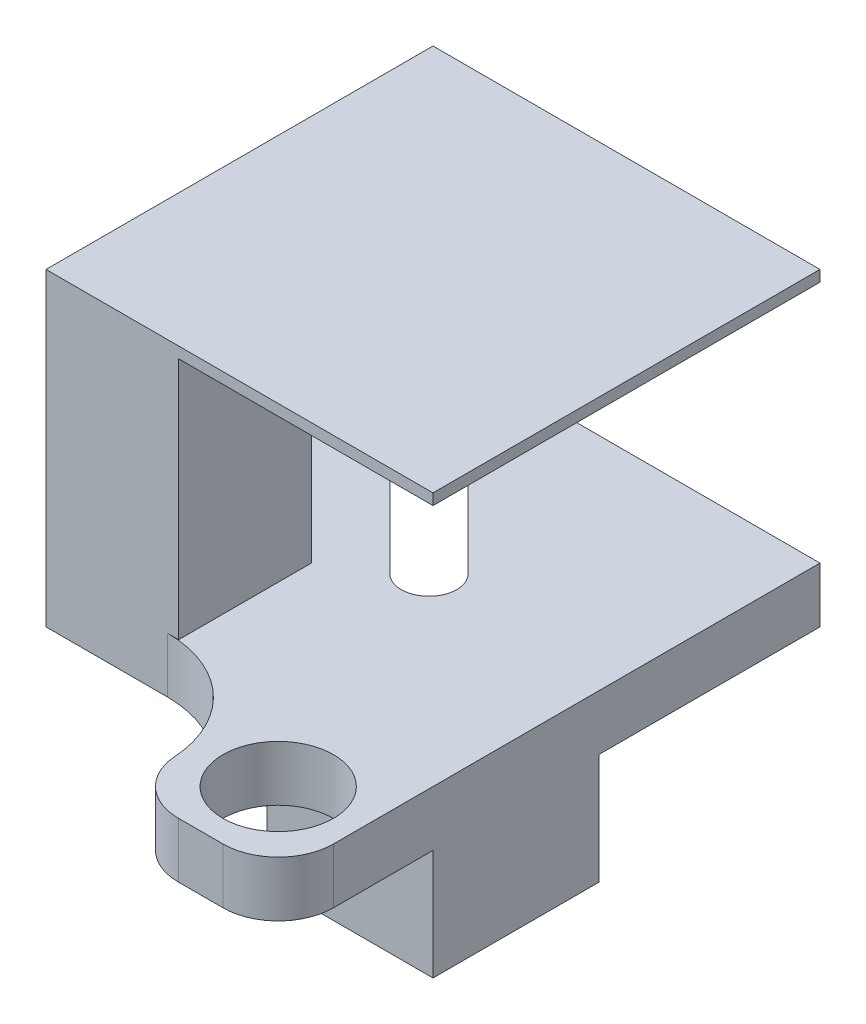
ISO-10303-21;
HEADER;
FILE_DESCRIPTION(('STEP AP214'),'2;1');
FILE_NAME('part.step','',(''),(''),'','','');
FILE_SCHEMA(('AUTOMOTIVE_DESIGN { 1 0 10303 214 1 1 1 1 }'));
ENDSEC;
DATA;
#1=APPLICATION_CONTEXT('core data for automotive mechanical design processes');
#2=APPLICATION_PROTOCOL_DEFINITION('international standard','automotive_design',2000,#1);
#3=PRODUCT_CONTEXT('',#1,'mechanical');
#4=PRODUCT('Part','Part','',(#3));
#5=PRODUCT_RELATED_PRODUCT_CATEGORY('part','',(#4));
#6=PRODUCT_DEFINITION_FORMATION('','',#4);
#7=PRODUCT_DEFINITION_CONTEXT('part definition',#1,'design');
#8=PRODUCT_DEFINITION('design','',#6,#7);
#9=PRODUCT_DEFINITION_SHAPE('','',#8);
#10=(LENGTH_UNIT() NAMED_UNIT(*) SI_UNIT(.MILLI.,.METRE.));
#11=(NAMED_UNIT(*) PLANE_ANGLE_UNIT() SI_UNIT($,.RADIAN.));
#12=(NAMED_UNIT(*) SI_UNIT($,.STERADIAN.) SOLID_ANGLE_UNIT());
#13=UNCERTAINTY_MEASURE_WITH_UNIT(LENGTH_MEASURE(1.E-05),#10,'distance_accuracy_value','');
#14=(GEOMETRIC_REPRESENTATION_CONTEXT(3) GLOBAL_UNCERTAINTY_ASSIGNED_CONTEXT((#13)) GLOBAL_UNIT_ASSIGNED_CONTEXT((#10,
#11,#12)) REPRESENTATION_CONTEXT('',''));
#15=CARTESIAN_POINT('',(0.,0.,0.));
#16=DIRECTION('',(0.,0.,1.));
#17=DIRECTION('',(1.,0.,0.));
#18=AXIS2_PLACEMENT_3D('',#15,#16,#17);
#19=CARTESIAN_POINT('',(21.,5.,0.));
#20=DIRECTION('',(0.,0.,-1.));
#21=DIRECTION('',(-1.,0.,0.));
#22=AXIS2_PLACEMENT_3D('',#19,#20,#21);
#23=PLANE('',#22);
#24=DIRECTION('',(-1.,0.,0.));
#25=VECTOR('',#24,1.);
#26=CARTESIAN_POINT('',(35.,0.,0.));
#27=LINE('',#26,#25);
#28=CARTESIAN_POINT('',(35.,0.,0.));
#29=VERTEX_POINT('',#28);
#30=CARTESIAN_POINT('',(20.,0.,0.));
#31=VERTEX_POINT('',#30);
#32=EDGE_CURVE('E264',#29,#31,#27,.T.);
#33=ORIENTED_EDGE('',*,*,#32,.T.);
#34=DIRECTION('',(0.,1.,0.));
#35=VECTOR('',#34,1.);
#36=CARTESIAN_POINT('',(20.,-10.,0.));
#37=LINE('',#36,#35);
#38=CARTESIAN_POINT('',(20.,-10.,0.));
#39=VERTEX_POINT('',#38);
#40=EDGE_CURVE('E306',#39,#31,#37,.T.);
#41=ORIENTED_EDGE('',*,*,#40,.F.);
#42=DIRECTION('',(-1.,0.,0.));
#43=VECTOR('',#42,1.);
#44=CARTESIAN_POINT('',(35.,-10.,0.));
#45=LINE('',#44,#43);
#46=CARTESIAN_POINT('',(35.,-10.,0.));
#47=VERTEX_POINT('',#46);
#48=EDGE_CURVE('E265',#47,#39,#45,.T.);
#49=ORIENTED_EDGE('',*,*,#48,.F.);
#50=DIRECTION('',(0.,1.,0.));
#51=VECTOR('',#50,1.);
#52=CARTESIAN_POINT('',(35.,-10.,0.));
#53=LINE('',#52,#51);
#54=EDGE_CURVE('E279',#47,#29,#53,.T.);
#55=ORIENTED_EDGE('',*,*,#54,.T.);
#56=EDGE_LOOP('',(#33,#41,#49,#55));
#57=FACE_BOUND('',#56,.T.);
#58=ADVANCED_FACE('F33',(#57),#23,.F.);
#59=CARTESIAN_POINT('',(0.,5.,0.));
#60=DIRECTION('',(0.,-1.,0.));
#61=DIRECTION('',(0.,0.,-1.));
#62=AXIS2_PLACEMENT_3D('',#59,#60,#61);
#63=PLANE('',#62);
#64=CARTESIAN_POINT('',(28.,5.,7.));
#65=DIRECTION('',(0.,1.,0.));
#66=DIRECTION('',(0.,0.,1.));
#67=AXIS2_PLACEMENT_3D('',#64,#65,#66);
#68=CIRCLE('',#67,5.);
#69=CARTESIAN_POINT('',(28.,5.,12.));
#70=VERTEX_POINT('',#69);
#71=EDGE_CURVE('E310',#70,#70,#68,.T.);
#72=ORIENTED_EDGE('',*,*,#71,.F.);
#73=EDGE_LOOP('',(#72));
#74=FACE_BOUND('',#73,.T.);
#75=CARTESIAN_POINT('',(3.8408297161038,5.,-30.8136023073707));
#76=DIRECTION('',(0.,1.,0.));
#77=DIRECTION('',(0.,0.,1.));
#78=AXIS2_PLACEMENT_3D('',#75,#76,#77);
#79=CIRCLE('',#78,2.50307538743037);
#80=CARTESIAN_POINT('',(5.77728434988736,5.,-32.3996445030446));
#81=VERTEX_POINT('',#80);
#82=CARTESIAN_POINT('',(2.07088813583075,5.,-29.0436607270975));
#83=VERTEX_POINT('',#82);
#84=EDGE_CURVE('E316',#81,#83,#79,.T.);
#85=ORIENTED_EDGE('',*,*,#84,.F.);
#86=DIRECTION('',(-0.707106781186551,0.,-0.707106781186543));
#87=VECTOR('',#86,1.);
#88=CARTESIAN_POINT('',(5.77728434988736,5.,-32.3996445030446));
#89=LINE('',#88,#87);
#90=CARTESIAN_POINT('',(19.9194199736268,5.,-18.2575088793053));
#91=VERTEX_POINT('',#90);
#92=EDGE_CURVE('E324',#91,#81,#89,.T.);
#93=ORIENTED_EDGE('',*,*,#92,.F.);
#94=CARTESIAN_POINT('',(18.1494783933532,5.,-16.4875672990317));
#95=DIRECTION('',(0.,1.,0.));
#96=DIRECTION('',(0.,0.,1.));
#97=AXIS2_PLACEMENT_3D('',#94,#95,#96);
#98=CIRCLE('',#97,2.50307538743099);
#99=CARTESIAN_POINT('',(16.2130237595617,5.,-14.9015251033665));
#100=VERTEX_POINT('',#99);
#101=EDGE_CURVE('E321',#100,#91,#98,.T.);
#102=ORIENTED_EDGE('',*,*,#101,.F.);
#103=DIRECTION('',(0.707106781186549,0.,0.707106781186546));
#104=VECTOR('',#103,1.);
#105=CARTESIAN_POINT('',(16.2130237595617,5.,-14.9015251033666));
#106=LINE('',#105,#104);
#107=EDGE_CURVE('E318',#83,#100,#106,.T.);
#108=ORIENTED_EDGE('',*,*,#107,.F.);
#109=EDGE_LOOP('',(#85,#93,#102,#108));
#110=FACE_BOUND('',#109,.T.);
#111=DIRECTION('',(1.,0.,0.));
#112=VECTOR('',#111,1.);
#113=CARTESIAN_POINT('',(35.,5.,14.));
#114=LINE('',#113,#112);
#115=CARTESIAN_POINT('',(25.9666295470958,5.,14.));
#116=VERTEX_POINT('',#115);
#117=CARTESIAN_POINT('',(30.,5.,14.));
#118=VERTEX_POINT('',#117);
#119=EDGE_CURVE('E347',#116,#118,#114,.T.);
#120=ORIENTED_EDGE('',*,*,#119,.T.);
#121=CARTESIAN_POINT('',(30.,5.,9.));
#122=DIRECTION('',(0.,-1.,0.));
#123=DIRECTION('',(0.,0.,-1.));
#124=AXIS2_PLACEMENT_3D('',#121,#122,#123);
#125=CIRCLE('',#124,5.);
#126=CARTESIAN_POINT('',(35.,5.,9.));
#127=VERTEX_POINT('',#126);
#128=EDGE_CURVE('E41',#118,#127,#125,.F.);
#129=ORIENTED_EDGE('',*,*,#128,.T.);
#130=DIRECTION('',(0.,0.,-1.));
#131=VECTOR('',#130,1.);
#132=CARTESIAN_POINT('',(35.,5.,0.));
#133=LINE('',#132,#131);
#134=CARTESIAN_POINT('',(35.,5.,-35.));
#135=VERTEX_POINT('',#134);
#136=EDGE_CURVE('E349',#127,#135,#133,.T.);
#137=ORIENTED_EDGE('',*,*,#136,.T.);
#138=DIRECTION('',(-1.,0.,0.));
#139=VECTOR('',#138,1.);
#140=CARTESIAN_POINT('',(35.,5.,-35.));
#141=LINE('',#140,#139);
#142=CARTESIAN_POINT('',(0.,5.,-35.));
#143=VERTEX_POINT('',#142);
#144=EDGE_CURVE('E351',#135,#143,#141,.T.);
#145=ORIENTED_EDGE('',*,*,#144,.T.);
#146=DIRECTION('',(0.,0.,1.));
#147=VECTOR('',#146,1.);
#148=CARTESIAN_POINT('',(0.,5.,0.));
#149=LINE('',#148,#147);
#150=CARTESIAN_POINT('',(0.,5.,-12.));
#151=VERTEX_POINT('',#150);
#152=EDGE_CURVE('E209',#143,#151,#149,.T.);
#153=ORIENTED_EDGE('',*,*,#152,.T.);
#154=DIRECTION('',(-1.,0.,0.));
#155=VECTOR('',#154,1.);
#156=CARTESIAN_POINT('',(0.,5.,-12.));
#157=LINE('',#156,#155);
#158=CARTESIAN_POINT('',(12.,5.,-12.));
#159=VERTEX_POINT('',#158);
#160=EDGE_CURVE('E248',#159,#151,#157,.T.);
#161=ORIENTED_EDGE('',*,*,#160,.F.);
#162=DIRECTION('',(0.,0.,-1.));
#163=VECTOR('',#162,1.);
#164=CARTESIAN_POINT('',(12.,5.,0.));
#165=LINE('',#164,#163);
#166=CARTESIAN_POINT('',(12.,5.,0.));
#167=VERTEX_POINT('',#166);
#168=EDGE_CURVE('E243',#167,#159,#165,.T.);
#169=ORIENTED_EDGE('',*,*,#168,.F.);
#170=DIRECTION('',(1.,0.,0.));
#171=VECTOR('',#170,1.);
#172=CARTESIAN_POINT('',(0.,5.,0.));
#173=LINE('',#172,#171);
#174=CARTESIAN_POINT('',(11.,5.,0.));
#175=VERTEX_POINT('',#174);
#176=EDGE_CURVE('E368',#175,#167,#173,.T.);
#177=ORIENTED_EDGE('',*,*,#176,.F.);
#178=CARTESIAN_POINT('',(11.,5.,10.));
#179=DIRECTION('',(0.,-1.,0.));
#180=DIRECTION('',(0.,0.,-1.));
#181=AXIS2_PLACEMENT_3D('',#178,#179,#180);
#182=CIRCLE('',#181,10.);
#183=CARTESIAN_POINT('',(20.9777530313972,5.,9.33333333333333));
#184=VERTEX_POINT('',#183);
#185=EDGE_CURVE('E375',#175,#184,#182,.T.);
#186=ORIENTED_EDGE('',*,*,#185,.T.);
#187=CARTESIAN_POINT('',(25.9666295470958,5.,9.));
#188=DIRECTION('',(0.,-1.,0.));
#189=DIRECTION('',(0.,0.,-1.));
#190=AXIS2_PLACEMENT_3D('',#187,#188,#189);
#191=CIRCLE('',#190,5.);
#192=EDGE_CURVE('E388',#184,#116,#191,.F.);
#193=ORIENTED_EDGE('',*,*,#192,.T.);
#194=EDGE_LOOP('',(#120,#129,#137,#145,#153,#161,#169,#177,#186,#193));
#195=FACE_BOUND('',#194,.T.);
#196=ADVANCED_FACE('F392',(#74,#110,#195),#63,.F.);
#197=CARTESIAN_POINT('',(0.,0.,0.));
#198=DIRECTION('',(0.,-1.,0.));
#199=DIRECTION('',(0.,0.,-1.));
#200=AXIS2_PLACEMENT_3D('',#197,#198,#199);
#201=PLANE('',#200);
#202=DIRECTION('',(0.,0.,-1.));
#203=VECTOR('',#202,1.);
#204=CARTESIAN_POINT('',(35.,0.,-35.));
#205=LINE('',#204,#203);
#206=CARTESIAN_POINT('',(35.,0.,9.));
#207=VERTEX_POINT('',#206);
#208=EDGE_CURVE('E359',#207,#29,#205,.T.);
#209=ORIENTED_EDGE('',*,*,#208,.F.);
#210=CARTESIAN_POINT('',(30.,0.,9.));
#211=DIRECTION('',(0.,-1.,0.));
#212=DIRECTION('',(0.,0.,-1.));
#213=AXIS2_PLACEMENT_3D('',#210,#211,#212);
#214=CIRCLE('',#213,5.);
#215=CARTESIAN_POINT('',(30.,0.,14.));
#216=VERTEX_POINT('',#215);
#217=EDGE_CURVE('E382',#207,#216,#214,.T.);
#218=ORIENTED_EDGE('',*,*,#217,.T.);
#219=DIRECTION('',(1.,0.,0.));
#220=VECTOR('',#219,1.);
#221=CARTESIAN_POINT('',(35.,0.,14.));
#222=LINE('',#221,#220);
#223=CARTESIAN_POINT('',(25.9666295470958,0.,14.));
#224=VERTEX_POINT('',#223);
#225=EDGE_CURVE('E356',#224,#216,#222,.T.);
#226=ORIENTED_EDGE('',*,*,#225,.F.);
#227=CARTESIAN_POINT('',(25.9666295470958,0.,9.));
#228=DIRECTION('',(0.,-1.,0.));
#229=DIRECTION('',(0.,0.,-1.));
#230=AXIS2_PLACEMENT_3D('',#227,#228,#229);
#231=CIRCLE('',#230,5.);
#232=CARTESIAN_POINT('',(20.9777530313972,0.,9.33333333333333));
#233=VERTEX_POINT('',#232);
#234=EDGE_CURVE('E380',#224,#233,#231,.T.);
#235=ORIENTED_EDGE('',*,*,#234,.T.);
#236=CARTESIAN_POINT('',(11.,0.,10.));
#237=DIRECTION('',(0.,-1.,0.));
#238=DIRECTION('',(0.,0.,-1.));
#239=AXIS2_PLACEMENT_3D('',#236,#237,#238);
#240=CIRCLE('',#239,10.);
#241=CARTESIAN_POINT('',(11.,0.,0.));
#242=VERTEX_POINT('',#241);
#243=EDGE_CURVE('E373',#233,#242,#240,.F.);
#244=ORIENTED_EDGE('',*,*,#243,.T.);
#245=DIRECTION('',(1.,0.,0.));
#246=VECTOR('',#245,1.);
#247=CARTESIAN_POINT('',(21.,0.,0.));
#248=LINE('',#247,#246);
#249=EDGE_CURVE('E346',#242,#31,#248,.T.);
#250=ORIENTED_EDGE('',*,*,#249,.T.);
#251=ORIENTED_EDGE('',*,*,#32,.F.);
#252=EDGE_LOOP('',(#209,#218,#226,#235,#244,#250,#251));
#253=FACE_BOUND('',#252,.T.);
#254=CARTESIAN_POINT('',(28.,0.,7.));
#255=DIRECTION('',(0.,1.,0.));
#256=DIRECTION('',(0.,0.,1.));
#257=AXIS2_PLACEMENT_3D('',#254,#255,#256);
#258=CIRCLE('',#257,5.);
#259=CARTESIAN_POINT('',(28.,0.,12.));
#260=VERTEX_POINT('',#259);
#261=EDGE_CURVE('E309',#260,#260,#258,.T.);
#262=ORIENTED_EDGE('',*,*,#261,.T.);
#263=EDGE_LOOP('',(#262));
#264=FACE_BOUND('',#263,.T.);
#265=ADVANCED_FACE('F403',(#253,#264),#201,.T.);
#266=DIRECTION('',(1.,0.,0.));
#267=VECTOR('',#266,1.);
#268=CARTESIAN_POINT('',(35.,0.,-15.));
#269=LINE('',#268,#267);
#270=CARTESIAN_POINT('',(30.,0.,-15.));
#271=VERTEX_POINT('',#270);
#272=CARTESIAN_POINT('',(35.,0.,-15.));
#273=VERTEX_POINT('',#272);
#274=EDGE_CURVE('E269',#271,#273,#269,.T.);
#275=ORIENTED_EDGE('',*,*,#274,.F.);
#276=DIRECTION('',(0.,0.,-1.));
#277=VECTOR('',#276,1.);
#278=CARTESIAN_POINT('',(30.,0.,-5.));
#279=LINE('',#278,#277);
#280=CARTESIAN_POINT('',(30.,0.,-5.));
#281=VERTEX_POINT('',#280);
#282=EDGE_CURVE('E287',#281,#271,#279,.T.);
#283=ORIENTED_EDGE('',*,*,#282,.F.);
#284=DIRECTION('',(1.,0.,0.));
#285=VECTOR('',#284,1.);
#286=CARTESIAN_POINT('',(30.,0.,-5.));
#287=LINE('',#286,#285);
#288=CARTESIAN_POINT('',(20.,0.,-5.));
#289=VERTEX_POINT('',#288);
#290=EDGE_CURVE('E284',#289,#281,#287,.T.);
#291=ORIENTED_EDGE('',*,*,#290,.F.);
#292=DIRECTION('',(0.,0.,-1.));
#293=VECTOR('',#292,1.);
#294=CARTESIAN_POINT('',(20.,0.,0.));
#295=LINE('',#294,#293);
#296=EDGE_CURVE('E281',#31,#289,#295,.T.);
#297=ORIENTED_EDGE('',*,*,#296,.F.);
#298=ORIENTED_EDGE('',*,*,#249,.F.);
#299=CARTESIAN_POINT('',(0.,0.,0.));
#300=VERTEX_POINT('',#299);
#301=EDGE_CURVE('E354',#300,#242,#248,.T.);
#302=ORIENTED_EDGE('',*,*,#301,.F.);
#303=DIRECTION('',(0.,0.,1.));
#304=VECTOR('',#303,1.);
#305=CARTESIAN_POINT('',(0.,0.,0.));
#306=LINE('',#305,#304);
#307=CARTESIAN_POINT('',(0.,0.,-35.));
#308=VERTEX_POINT('',#307);
#309=EDGE_CURVE('E204',#308,#300,#306,.T.);
#310=ORIENTED_EDGE('',*,*,#309,.F.);
#311=DIRECTION('',(-1.,0.,0.));
#312=VECTOR('',#311,1.);
#313=CARTESIAN_POINT('',(35.,0.,-35.));
#314=LINE('',#313,#312);
#315=CARTESIAN_POINT('',(35.,0.,-35.));
#316=VERTEX_POINT('',#315);
#317=EDGE_CURVE('E361',#316,#308,#314,.T.);
#318=ORIENTED_EDGE('',*,*,#317,.F.);
#319=EDGE_CURVE('E358',#273,#316,#205,.T.);
#320=ORIENTED_EDGE('',*,*,#319,.F.);
#321=EDGE_LOOP('',(#275,#283,#291,#297,#298,#302,#310,#318,#320));
#322=FACE_BOUND('',#321,.T.);
#323=DIRECTION('',(-0.707106781186551,0.,-0.707106781186543));
#324=VECTOR('',#323,1.);
#325=CARTESIAN_POINT('',(5.77728434988736,0.,-32.3996445030446));
#326=LINE('',#325,#324);
#327=CARTESIAN_POINT('',(19.9194199736268,0.,-18.2575088793053));
#328=VERTEX_POINT('',#327);
#329=CARTESIAN_POINT('',(5.77728434988736,0.,-32.3996445030446));
#330=VERTEX_POINT('',#329);
#331=EDGE_CURVE('E319',#328,#330,#326,.T.);
#332=ORIENTED_EDGE('',*,*,#331,.T.);
#333=CARTESIAN_POINT('',(3.8408297161038,0.,-30.8136023073707));
#334=DIRECTION('',(0.,1.,0.));
#335=DIRECTION('',(0.,0.,1.));
#336=AXIS2_PLACEMENT_3D('',#333,#334,#335);
#337=CIRCLE('',#336,2.50307538743037);
#338=CARTESIAN_POINT('',(2.07088813583075,0.,-29.0436607270975));
#339=VERTEX_POINT('',#338);
#340=EDGE_CURVE('E313',#330,#339,#337,.T.);
#341=ORIENTED_EDGE('',*,*,#340,.T.);
#342=DIRECTION('',(0.707106781186549,0.,0.707106781186546));
#343=VECTOR('',#342,1.);
#344=CARTESIAN_POINT('',(16.2130237595617,0.,-14.9015251033666));
#345=LINE('',#344,#343);
#346=CARTESIAN_POINT('',(16.2130237595617,0.,-14.9015251033665));
#347=VERTEX_POINT('',#346);
#348=EDGE_CURVE('E329',#339,#347,#345,.T.);
#349=ORIENTED_EDGE('',*,*,#348,.T.);
#350=CARTESIAN_POINT('',(18.1494783933532,0.,-16.4875672990317));
#351=DIRECTION('',(0.,1.,0.));
#352=DIRECTION('',(0.,0.,1.));
#353=AXIS2_PLACEMENT_3D('',#350,#351,#352);
#354=CIRCLE('',#353,2.50307538743099);
#355=EDGE_CURVE('E332',#347,#328,#354,.T.);
#356=ORIENTED_EDGE('',*,*,#355,.T.);
#357=EDGE_LOOP('',(#332,#341,#349,#356));
#358=FACE_BOUND('',#357,.T.);
#359=ADVANCED_FACE('F416',(#322,#358),#201,.T.);
#360=ORIENTED_EDGE('',*,*,#301,.T.);
#361=DIRECTION('',(0.,-1.,0.));
#362=VECTOR('',#361,1.);
#363=CARTESIAN_POINT('',(11.,5.,0.));
#364=LINE('',#363,#362);
#365=EDGE_CURVE('E370',#242,#175,#364,.F.);
#366=ORIENTED_EDGE('',*,*,#365,.T.);
#367=ORIENTED_EDGE('',*,*,#176,.T.);
#368=DIRECTION('',(0.,-1.,0.));
#369=VECTOR('',#368,1.);
#370=CARTESIAN_POINT('',(12.,27.,0.));
#371=LINE('',#370,#369);
#372=CARTESIAN_POINT('',(12.,27.,0.));
#373=VERTEX_POINT('',#372);
#374=EDGE_CURVE('E261',#373,#167,#371,.T.);
#375=ORIENTED_EDGE('',*,*,#374,.F.);
#376=DIRECTION('',(1.,0.,0.));
#377=VECTOR('',#376,1.);
#378=CARTESIAN_POINT('',(0.,27.,0.));
#379=LINE('',#378,#377);
#380=CARTESIAN_POINT('',(35.,27.,0.));
#381=VERTEX_POINT('',#380);
#382=EDGE_CURVE('E235',#373,#381,#379,.T.);
#383=ORIENTED_EDGE('',*,*,#382,.T.);
#384=DIRECTION('',(0.,-1.,0.));
#385=VECTOR('',#384,1.);
#386=CARTESIAN_POINT('',(35.,28.,0.));
#387=LINE('',#386,#385);
#388=CARTESIAN_POINT('',(35.,28.,0.));
#389=VERTEX_POINT('',#388);
#390=EDGE_CURVE('E215',#389,#381,#387,.T.);
#391=ORIENTED_EDGE('',*,*,#390,.F.);
#392=DIRECTION('',(1.,0.,0.));
#393=VECTOR('',#392,1.);
#394=CARTESIAN_POINT('',(0.,28.,0.));
#395=LINE('',#394,#393);
#396=CARTESIAN_POINT('',(0.,28.,0.));
#397=VERTEX_POINT('',#396);
#398=EDGE_CURVE('E212',#397,#389,#395,.T.);
#399=ORIENTED_EDGE('',*,*,#398,.F.);
#400=DIRECTION('',(0.,-1.,0.));
#401=VECTOR('',#400,1.);
#402=CARTESIAN_POINT('',(0.,5.,0.));
#403=LINE('',#402,#401);
#404=EDGE_CURVE('E196',#397,#300,#403,.T.);
#405=ORIENTED_EDGE('',*,*,#404,.T.);
#406=EDGE_LOOP('',(#360,#366,#367,#375,#383,#391,#399,#405));
#407=FACE_BOUND('',#406,.T.);
#408=ADVANCED_FACE('F213',(#407),#23,.F.);
#409=CARTESIAN_POINT('',(35.,5.,14.));
#410=DIRECTION('',(0.,0.,-1.));
#411=DIRECTION('',(-1.,0.,0.));
#412=AXIS2_PLACEMENT_3D('',#409,#410,#411);
#413=PLANE('',#412);
#414=ORIENTED_EDGE('',*,*,#225,.T.);
#415=DIRECTION('',(0.,-1.,0.));
#416=VECTOR('',#415,1.);
#417=CARTESIAN_POINT('',(30.,5.,14.));
#418=LINE('',#417,#416);
#419=EDGE_CURVE('E54',#216,#118,#418,.F.);
#420=ORIENTED_EDGE('',*,*,#419,.T.);
#421=ORIENTED_EDGE('',*,*,#119,.F.);
#422=DIRECTION('',(0.,1.,0.));
#423=VECTOR('',#422,1.);
#424=CARTESIAN_POINT('',(25.9666295470958,5.,14.));
#425=LINE('',#424,#423);
#426=EDGE_CURVE('E384',#116,#224,#425,.F.);
#427=ORIENTED_EDGE('',*,*,#426,.T.);
#428=EDGE_LOOP('',(#414,#420,#421,#427));
#429=FACE_BOUND('',#428,.T.);
#430=ADVANCED_FACE('F406',(#429),#413,.F.);
#431=CARTESIAN_POINT('',(35.,5.,-35.));
#432=DIRECTION('',(-1.,0.,0.));
#433=DIRECTION('',(0.,0.,1.));
#434=AXIS2_PLACEMENT_3D('',#431,#432,#433);
#435=PLANE('',#434);
#436=ORIENTED_EDGE('',*,*,#136,.F.);
#437=DIRECTION('',(0.,-1.,0.));
#438=VECTOR('',#437,1.);
#439=CARTESIAN_POINT('',(35.,5.,9.));
#440=LINE('',#439,#438);
#441=EDGE_CURVE('E377',#127,#207,#440,.T.);
#442=ORIENTED_EDGE('',*,*,#441,.T.);
#443=ORIENTED_EDGE('',*,*,#208,.T.);
#444=ORIENTED_EDGE('',*,*,#54,.F.);
#445=DIRECTION('',(0.,0.,1.));
#446=VECTOR('',#445,1.);
#447=CARTESIAN_POINT('',(35.,-10.,-15.));
#448=LINE('',#447,#446);
#449=CARTESIAN_POINT('',(35.,-10.,-15.));
#450=VERTEX_POINT('',#449);
#451=EDGE_CURVE('E277',#450,#47,#448,.T.);
#452=ORIENTED_EDGE('',*,*,#451,.F.);
#453=DIRECTION('',(0.,1.,0.));
#454=VECTOR('',#453,1.);
#455=CARTESIAN_POINT('',(35.,-10.,-15.));
#456=LINE('',#455,#454);
#457=EDGE_CURVE('E294',#450,#273,#456,.T.);
#458=ORIENTED_EDGE('',*,*,#457,.T.);
#459=ORIENTED_EDGE('',*,*,#319,.T.);
#460=DIRECTION('',(0.,-1.,0.));
#461=VECTOR('',#460,1.);
#462=CARTESIAN_POINT('',(35.,5.,-35.));
#463=LINE('',#462,#461);
#464=EDGE_CURVE('E365',#135,#316,#463,.T.);
#465=ORIENTED_EDGE('',*,*,#464,.F.);
#466=EDGE_LOOP('',(#436,#442,#443,#444,#452,#458,#459,#465));
#467=FACE_BOUND('',#466,.T.);
#468=ADVANCED_FACE('F397',(#467),#435,.F.);
#469=CARTESIAN_POINT('',(35.,5.,-35.));
#470=DIRECTION('',(0.,0.,1.));
#471=DIRECTION('',(1.,0.,0.));
#472=AXIS2_PLACEMENT_3D('',#469,#470,#471);
#473=PLANE('',#472);
#474=ORIENTED_EDGE('',*,*,#317,.T.);
#475=DIRECTION('',(0.,-1.,0.));
#476=VECTOR('',#475,1.);
#477=CARTESIAN_POINT('',(0.,5.,-35.));
#478=LINE('',#477,#476);
#479=EDGE_CURVE('E208',#143,#308,#478,.T.);
#480=ORIENTED_EDGE('',*,*,#479,.F.);
#481=ORIENTED_EDGE('',*,*,#144,.F.);
#482=ORIENTED_EDGE('',*,*,#464,.T.);
#483=EDGE_LOOP('',(#474,#480,#481,#482));
#484=FACE_BOUND('',#483,.T.);
#485=ADVANCED_FACE('F476',(#484),#473,.F.);
#486=CARTESIAN_POINT('',(0.,5.,0.));
#487=DIRECTION('',(1.,0.,0.));
#488=DIRECTION('',(0.,0.,-1.));
#489=AXIS2_PLACEMENT_3D('',#486,#487,#488);
#490=PLANE('',#489);
#491=ORIENTED_EDGE('',*,*,#309,.T.);
#492=ORIENTED_EDGE('',*,*,#404,.F.);
#493=DIRECTION('',(0.,0.,1.));
#494=VECTOR('',#493,1.);
#495=CARTESIAN_POINT('',(0.,28.,0.));
#496=LINE('',#495,#494);
#497=CARTESIAN_POINT('',(0.,28.,-35.));
#498=VERTEX_POINT('',#497);
#499=EDGE_CURVE('E201',#498,#397,#496,.T.);
#500=ORIENTED_EDGE('',*,*,#499,.F.);
#501=DIRECTION('',(0.,-1.,0.));
#502=VECTOR('',#501,1.);
#503=CARTESIAN_POINT('',(0.,28.,-35.));
#504=LINE('',#503,#502);
#505=CARTESIAN_POINT('',(0.,27.,-35.));
#506=VERTEX_POINT('',#505);
#507=EDGE_CURVE('E231',#498,#506,#504,.T.);
#508=ORIENTED_EDGE('',*,*,#507,.T.);
#509=DIRECTION('',(0.,0.,1.));
#510=VECTOR('',#509,1.);
#511=CARTESIAN_POINT('',(0.,27.,0.));
#512=LINE('',#511,#510);
#513=CARTESIAN_POINT('',(0.,27.,-12.));
#514=VERTEX_POINT('',#513);
#515=EDGE_CURVE('E232',#506,#514,#512,.T.);
#516=ORIENTED_EDGE('',*,*,#515,.T.);
#517=DIRECTION('',(0.,-1.,0.));
#518=VECTOR('',#517,1.);
#519=CARTESIAN_POINT('',(0.,27.,-12.));
#520=LINE('',#519,#518);
#521=EDGE_CURVE('E251',#514,#151,#520,.T.);
#522=ORIENTED_EDGE('',*,*,#521,.T.);
#523=ORIENTED_EDGE('',*,*,#152,.F.);
#524=ORIENTED_EDGE('',*,*,#479,.T.);
#525=EDGE_LOOP('',(#491,#492,#500,#508,#516,#522,#523,#524));
#526=FACE_BOUND('',#525,.T.);
#527=ADVANCED_FACE('F198',(#526),#490,.F.);
#528=CARTESIAN_POINT('',(3.8408297161038,5.,-30.8136023073707));
#529=DIRECTION('',(0.,-1.,0.));
#530=DIRECTION('',(0.,0.,-1.));
#531=AXIS2_PLACEMENT_3D('',#528,#529,#530);
#532=CYLINDRICAL_SURFACE('',#531,2.50307538743037);
#533=ORIENTED_EDGE('',*,*,#340,.F.);
#534=DIRECTION('',(0.,-1.,0.));
#535=VECTOR('',#534,1.);
#536=CARTESIAN_POINT('',(5.77728434988736,5.,-32.3996445030446));
#537=LINE('',#536,#535);
#538=EDGE_CURVE('E326',#81,#330,#537,.T.);
#539=ORIENTED_EDGE('',*,*,#538,.F.);
#540=ORIENTED_EDGE('',*,*,#84,.T.);
#541=DIRECTION('',(0.,-1.,0.));
#542=VECTOR('',#541,1.);
#543=CARTESIAN_POINT('',(2.07088813583075,5.,-29.0436607270975));
#544=LINE('',#543,#542);
#545=EDGE_CURVE('E343',#83,#339,#544,.T.);
#546=ORIENTED_EDGE('',*,*,#545,.T.);
#547=EDGE_LOOP('',(#533,#539,#540,#546));
#548=FACE_BOUND('',#547,.T.);
#549=ADVANCED_FACE('F475',(#548),#532,.F.);
#550=CARTESIAN_POINT('',(16.2130237595617,5.,-14.9015251033666));
#551=DIRECTION('',(0.707106781186546,0.,-0.707106781186549));
#552=DIRECTION('',(-0.707106781186549,0.,-0.707106781186546));
#553=AXIS2_PLACEMENT_3D('',#550,#551,#552);
#554=PLANE('',#553);
#555=ORIENTED_EDGE('',*,*,#348,.F.);
#556=ORIENTED_EDGE('',*,*,#545,.F.);
#557=ORIENTED_EDGE('',*,*,#107,.T.);
#558=DIRECTION('',(0.,-1.,0.));
#559=VECTOR('',#558,1.);
#560=CARTESIAN_POINT('',(16.2130237595617,5.,-14.9015251033665));
#561=LINE('',#560,#559);
#562=EDGE_CURVE('E341',#100,#347,#561,.T.);
#563=ORIENTED_EDGE('',*,*,#562,.T.);
#564=EDGE_LOOP('',(#555,#556,#557,#563));
#565=FACE_BOUND('',#564,.T.);
#566=ADVANCED_FACE('F502',(#565),#554,.T.);
#567=CARTESIAN_POINT('',(18.1494783933532,5.,-16.4875672990317));
#568=DIRECTION('',(0.,-1.,0.));
#569=DIRECTION('',(0.,0.,-1.));
#570=AXIS2_PLACEMENT_3D('',#567,#568,#569);
#571=CYLINDRICAL_SURFACE('',#570,2.50307538743099);
#572=ORIENTED_EDGE('',*,*,#355,.F.);
#573=ORIENTED_EDGE('',*,*,#562,.F.);
#574=ORIENTED_EDGE('',*,*,#101,.T.);
#575=DIRECTION('',(0.,-1.,0.));
#576=VECTOR('',#575,1.);
#577=CARTESIAN_POINT('',(19.9194199736268,5.,-18.2575088793053));
#578=LINE('',#577,#576);
#579=EDGE_CURVE('E339',#91,#328,#578,.T.);
#580=ORIENTED_EDGE('',*,*,#579,.T.);
#581=EDGE_LOOP('',(#572,#573,#574,#580));
#582=FACE_BOUND('',#581,.T.);
#583=ADVANCED_FACE('F509',(#582),#571,.F.);
#584=CARTESIAN_POINT('',(5.77728434988736,5.,-32.3996445030446));
#585=DIRECTION('',(-0.707106781186544,0.,0.707106781186552));
#586=DIRECTION('',(0.707106781186552,0.,0.707106781186544));
#587=AXIS2_PLACEMENT_3D('',#584,#585,#586);
#588=PLANE('',#587);
#589=ORIENTED_EDGE('',*,*,#331,.F.);
#590=ORIENTED_EDGE('',*,*,#579,.F.);
#591=ORIENTED_EDGE('',*,*,#92,.T.);
#592=ORIENTED_EDGE('',*,*,#538,.T.);
#593=EDGE_LOOP('',(#589,#590,#591,#592));
#594=FACE_BOUND('',#593,.T.);
#595=ADVANCED_FACE('F450',(#594),#588,.T.);
#596=CARTESIAN_POINT('',(28.,5.,7.));
#597=DIRECTION('',(0.,-1.,0.));
#598=DIRECTION('',(0.,0.,-1.));
#599=AXIS2_PLACEMENT_3D('',#596,#597,#598);
#600=CYLINDRICAL_SURFACE('',#599,5.);
#601=ORIENTED_EDGE('',*,*,#71,.T.);
#602=EDGE_LOOP('',(#601));
#603=FACE_BOUND('',#602,.T.);
#604=ORIENTED_EDGE('',*,*,#261,.F.);
#605=EDGE_LOOP('',(#604));
#606=FACE_BOUND('',#605,.T.);
#607=ADVANCED_FACE('F443',(#603,#606),#600,.F.);
#608=CARTESIAN_POINT('',(20.,-10.,0.));
#609=DIRECTION('',(1.,0.,0.));
#610=DIRECTION('',(0.,0.,-1.));
#611=AXIS2_PLACEMENT_3D('',#608,#609,#610);
#612=PLANE('',#611);
#613=ORIENTED_EDGE('',*,*,#296,.T.);
#614=DIRECTION('',(0.,1.,0.));
#615=VECTOR('',#614,1.);
#616=CARTESIAN_POINT('',(20.,-10.,-5.));
#617=LINE('',#616,#615);
#618=CARTESIAN_POINT('',(20.,-10.,-5.));
#619=VERTEX_POINT('',#618);
#620=EDGE_CURVE('E303',#619,#289,#617,.T.);
#621=ORIENTED_EDGE('',*,*,#620,.F.);
#622=DIRECTION('',(0.,0.,-1.));
#623=VECTOR('',#622,1.);
#624=CARTESIAN_POINT('',(20.,-10.,0.));
#625=LINE('',#624,#623);
#626=EDGE_CURVE('E268',#39,#619,#625,.T.);
#627=ORIENTED_EDGE('',*,*,#626,.F.);
#628=ORIENTED_EDGE('',*,*,#40,.T.);
#629=EDGE_LOOP('',(#613,#621,#627,#628));
#630=FACE_BOUND('',#629,.T.);
#631=ADVANCED_FACE('F441',(#630),#612,.F.);
#632=CARTESIAN_POINT('',(30.,-10.,-5.));
#633=DIRECTION('',(0.,0.,1.));
#634=DIRECTION('',(1.,0.,0.));
#635=AXIS2_PLACEMENT_3D('',#632,#633,#634);
#636=PLANE('',#635);
#637=ORIENTED_EDGE('',*,*,#290,.T.);
#638=DIRECTION('',(0.,1.,0.));
#639=VECTOR('',#638,1.);
#640=CARTESIAN_POINT('',(30.,-10.,-5.));
#641=LINE('',#640,#639);
#642=CARTESIAN_POINT('',(30.,-10.,-5.));
#643=VERTEX_POINT('',#642);
#644=EDGE_CURVE('E300',#643,#281,#641,.T.);
#645=ORIENTED_EDGE('',*,*,#644,.F.);
#646=DIRECTION('',(1.,0.,0.));
#647=VECTOR('',#646,1.);
#648=CARTESIAN_POINT('',(30.,-10.,-5.));
#649=LINE('',#648,#647);
#650=EDGE_CURVE('E271',#619,#643,#649,.T.);
#651=ORIENTED_EDGE('',*,*,#650,.F.);
#652=ORIENTED_EDGE('',*,*,#620,.T.);
#653=EDGE_LOOP('',(#637,#645,#651,#652));
#654=FACE_BOUND('',#653,.T.);
#655=ADVANCED_FACE('F438',(#654),#636,.F.);
#656=CARTESIAN_POINT('',(30.,-10.,-5.));
#657=DIRECTION('',(1.,0.,0.));
#658=DIRECTION('',(0.,0.,-1.));
#659=AXIS2_PLACEMENT_3D('',#656,#657,#658);
#660=PLANE('',#659);
#661=ORIENTED_EDGE('',*,*,#282,.T.);
#662=DIRECTION('',(0.,1.,0.));
#663=VECTOR('',#662,1.);
#664=CARTESIAN_POINT('',(30.,-10.,-15.));
#665=LINE('',#664,#663);
#666=CARTESIAN_POINT('',(30.,-10.,-15.));
#667=VERTEX_POINT('',#666);
#668=EDGE_CURVE('E297',#667,#271,#665,.T.);
#669=ORIENTED_EDGE('',*,*,#668,.F.);
#670=DIRECTION('',(0.,0.,-1.));
#671=VECTOR('',#670,1.);
#672=CARTESIAN_POINT('',(30.,-10.,-5.));
#673=LINE('',#672,#671);
#674=EDGE_CURVE('E273',#643,#667,#673,.T.);
#675=ORIENTED_EDGE('',*,*,#674,.F.);
#676=ORIENTED_EDGE('',*,*,#644,.T.);
#677=EDGE_LOOP('',(#661,#669,#675,#676));
#678=FACE_BOUND('',#677,.T.);
#679=ADVANCED_FACE('F434',(#678),#660,.F.);
#680=CARTESIAN_POINT('',(35.,-10.,-15.));
#681=DIRECTION('',(0.,0.,1.));
#682=DIRECTION('',(1.,0.,0.));
#683=AXIS2_PLACEMENT_3D('',#680,#681,#682);
#684=PLANE('',#683);
#685=ORIENTED_EDGE('',*,*,#274,.T.);
#686=ORIENTED_EDGE('',*,*,#457,.F.);
#687=DIRECTION('',(1.,0.,0.));
#688=VECTOR('',#687,1.);
#689=CARTESIAN_POINT('',(35.,-10.,-15.));
#690=LINE('',#689,#688);
#691=EDGE_CURVE('E275',#667,#450,#690,.T.);
#692=ORIENTED_EDGE('',*,*,#691,.F.);
#693=ORIENTED_EDGE('',*,*,#668,.T.);
#694=EDGE_LOOP('',(#685,#686,#692,#693));
#695=FACE_BOUND('',#694,.T.);
#696=ADVANCED_FACE('F432',(#695),#684,.F.);
#697=CARTESIAN_POINT('',(0.,-10.,0.));
#698=DIRECTION('',(0.,-1.,0.));
#699=DIRECTION('',(0.,0.,-1.));
#700=AXIS2_PLACEMENT_3D('',#697,#698,#699);
#701=PLANE('',#700);
#702=ORIENTED_EDGE('',*,*,#48,.T.);
#703=ORIENTED_EDGE('',*,*,#626,.T.);
#704=ORIENTED_EDGE('',*,*,#650,.T.);
#705=ORIENTED_EDGE('',*,*,#674,.T.);
#706=ORIENTED_EDGE('',*,*,#691,.T.);
#707=ORIENTED_EDGE('',*,*,#451,.T.);
#708=EDGE_LOOP('',(#702,#703,#704,#705,#706,#707));
#709=FACE_BOUND('',#708,.T.);
#710=ADVANCED_FACE('F427',(#709),#701,.T.);
#711=CARTESIAN_POINT('',(12.,27.,0.));
#712=DIRECTION('',(-1.,0.,0.));
#713=DIRECTION('',(0.,0.,1.));
#714=AXIS2_PLACEMENT_3D('',#711,#712,#713);
#715=PLANE('',#714);
#716=ORIENTED_EDGE('',*,*,#168,.T.);
#717=DIRECTION('',(0.,-1.,0.));
#718=VECTOR('',#717,1.);
#719=CARTESIAN_POINT('',(12.,27.,-12.));
#720=LINE('',#719,#718);
#721=CARTESIAN_POINT('',(12.,27.,-12.));
#722=VERTEX_POINT('',#721);
#723=EDGE_CURVE('E258',#722,#159,#720,.T.);
#724=ORIENTED_EDGE('',*,*,#723,.F.);
#725=DIRECTION('',(0.,0.,-1.));
#726=VECTOR('',#725,1.);
#727=CARTESIAN_POINT('',(12.,27.,0.));
#728=LINE('',#727,#726);
#729=EDGE_CURVE('E244',#373,#722,#728,.T.);
#730=ORIENTED_EDGE('',*,*,#729,.F.);
#731=ORIENTED_EDGE('',*,*,#374,.T.);
#732=EDGE_LOOP('',(#716,#724,#730,#731));
#733=FACE_BOUND('',#732,.T.);
#734=ADVANCED_FACE('F560',(#733),#715,.F.);
#735=CARTESIAN_POINT('',(0.,27.,-12.));
#736=DIRECTION('',(0.,0.,1.));
#737=DIRECTION('',(1.,0.,0.));
#738=AXIS2_PLACEMENT_3D('',#735,#736,#737);
#739=PLANE('',#738);
#740=ORIENTED_EDGE('',*,*,#160,.T.);
#741=ORIENTED_EDGE('',*,*,#521,.F.);
#742=DIRECTION('',(-1.,0.,0.));
#743=VECTOR('',#742,1.);
#744=CARTESIAN_POINT('',(0.,27.,-12.));
#745=LINE('',#744,#743);
#746=EDGE_CURVE('E247',#722,#514,#745,.T.);
#747=ORIENTED_EDGE('',*,*,#746,.F.);
#748=ORIENTED_EDGE('',*,*,#723,.T.);
#749=EDGE_LOOP('',(#740,#741,#747,#748));
#750=FACE_BOUND('',#749,.T.);
#751=ADVANCED_FACE('F569',(#750),#739,.F.);
#752=CARTESIAN_POINT('',(35.,28.,0.));
#753=DIRECTION('',(-1.,0.,0.));
#754=DIRECTION('',(0.,0.,1.));
#755=AXIS2_PLACEMENT_3D('',#752,#753,#754);
#756=PLANE('',#755);
#757=DIRECTION('',(0.,0.,-1.));
#758=VECTOR('',#757,1.);
#759=CARTESIAN_POINT('',(35.,27.,0.));
#760=LINE('',#759,#758);
#761=CARTESIAN_POINT('',(35.,27.,-35.));
#762=VERTEX_POINT('',#761);
#763=EDGE_CURVE('E226',#381,#762,#760,.T.);
#764=ORIENTED_EDGE('',*,*,#763,.T.);
#765=DIRECTION('',(0.,-1.,0.));
#766=VECTOR('',#765,1.);
#767=CARTESIAN_POINT('',(35.,28.,-35.));
#768=LINE('',#767,#766);
#769=CARTESIAN_POINT('',(35.,28.,-35.));
#770=VERTEX_POINT('',#769);
#771=EDGE_CURVE('E239',#770,#762,#768,.T.);
#772=ORIENTED_EDGE('',*,*,#771,.F.);
#773=DIRECTION('',(0.,0.,-1.));
#774=VECTOR('',#773,1.);
#775=CARTESIAN_POINT('',(35.,28.,0.));
#776=LINE('',#775,#774);
#777=EDGE_CURVE('E218',#389,#770,#776,.T.);
#778=ORIENTED_EDGE('',*,*,#777,.F.);
#779=ORIENTED_EDGE('',*,*,#390,.T.);
#780=EDGE_LOOP('',(#764,#772,#778,#779));
#781=FACE_BOUND('',#780,.T.);
#782=ADVANCED_FACE('F577',(#781),#756,.F.);
#783=CARTESIAN_POINT('',(0.,28.,-35.));
#784=DIRECTION('',(0.,0.,1.));
#785=DIRECTION('',(1.,0.,0.));
#786=AXIS2_PLACEMENT_3D('',#783,#784,#785);
#787=PLANE('',#786);
#788=DIRECTION('',(-1.,0.,0.));
#789=VECTOR('',#788,1.);
#790=CARTESIAN_POINT('',(0.,27.,-35.));
#791=LINE('',#790,#789);
#792=EDGE_CURVE('E224',#762,#506,#791,.T.);
#793=ORIENTED_EDGE('',*,*,#792,.T.);
#794=ORIENTED_EDGE('',*,*,#507,.F.);
#795=DIRECTION('',(-1.,0.,0.));
#796=VECTOR('',#795,1.);
#797=CARTESIAN_POINT('',(0.,28.,-35.));
#798=LINE('',#797,#796);
#799=EDGE_CURVE('E222',#770,#498,#798,.T.);
#800=ORIENTED_EDGE('',*,*,#799,.F.);
#801=ORIENTED_EDGE('',*,*,#771,.T.);
#802=EDGE_LOOP('',(#793,#794,#800,#801));
#803=FACE_BOUND('',#802,.T.);
#804=ADVANCED_FACE('F585',(#803),#787,.F.);
#805=CARTESIAN_POINT('',(0.,28.,0.));
#806=DIRECTION('',(0.,-1.,0.));
#807=DIRECTION('',(0.,0.,-1.));
#808=AXIS2_PLACEMENT_3D('',#805,#806,#807);
#809=PLANE('',#808);
#810=ORIENTED_EDGE('',*,*,#499,.T.);
#811=ORIENTED_EDGE('',*,*,#398,.T.);
#812=ORIENTED_EDGE('',*,*,#777,.T.);
#813=ORIENTED_EDGE('',*,*,#799,.T.);
#814=EDGE_LOOP('',(#810,#811,#812,#813));
#815=FACE_BOUND('',#814,.T.);
#816=ADVANCED_FACE('F220',(#815),#809,.F.);
#817=CARTESIAN_POINT('',(0.,27.,0.));
#818=DIRECTION('',(0.,-1.,0.));
#819=DIRECTION('',(0.,0.,-1.));
#820=AXIS2_PLACEMENT_3D('',#817,#818,#819);
#821=PLANE('',#820);
#822=ORIENTED_EDGE('',*,*,#382,.F.);
#823=ORIENTED_EDGE('',*,*,#729,.T.);
#824=ORIENTED_EDGE('',*,*,#746,.T.);
#825=ORIENTED_EDGE('',*,*,#515,.F.);
#826=ORIENTED_EDGE('',*,*,#792,.F.);
#827=ORIENTED_EDGE('',*,*,#763,.F.);
#828=EDGE_LOOP('',(#822,#823,#824,#825,#826,#827));
#829=FACE_BOUND('',#828,.T.);
#830=ADVANCED_FACE('F600',(#829),#821,.T.);
#831=CARTESIAN_POINT('',(11.,5.,10.));
#832=DIRECTION('',(0.,1.,0.));
#833=DIRECTION('',(0.,0.,1.));
#834=AXIS2_PLACEMENT_3D('',#831,#832,#833);
#835=CYLINDRICAL_SURFACE('',#834,10.);
#836=ORIENTED_EDGE('',*,*,#243,.F.);
#837=DIRECTION('',(0.,1.,0.));
#838=VECTOR('',#837,1.);
#839=CARTESIAN_POINT('',(20.9777530313972,5.,9.33333333333333));
#840=LINE('',#839,#838);
#841=EDGE_CURVE('E11',#233,#184,#840,.T.);
#842=ORIENTED_EDGE('',*,*,#841,.T.);
#843=ORIENTED_EDGE('',*,*,#185,.F.);
#844=ORIENTED_EDGE('',*,*,#365,.F.);
#845=EDGE_LOOP('',(#836,#842,#843,#844));
#846=FACE_BOUND('',#845,.T.);
#847=ADVANCED_FACE('F413',(#846),#835,.F.);
#848=CARTESIAN_POINT('',(30.,5.,9.));
#849=DIRECTION('',(0.,-1.,0.));
#850=DIRECTION('',(0.,0.,-1.));
#851=AXIS2_PLACEMENT_3D('',#848,#849,#850);
#852=CYLINDRICAL_SURFACE('',#851,5.);
#853=ORIENTED_EDGE('',*,*,#128,.F.);
#854=ORIENTED_EDGE('',*,*,#419,.F.);
#855=ORIENTED_EDGE('',*,*,#217,.F.);
#856=ORIENTED_EDGE('',*,*,#441,.F.);
#857=EDGE_LOOP('',(#853,#854,#855,#856));
#858=FACE_BOUND('',#857,.T.);
#859=ADVANCED_FACE('F400',(#858),#852,.T.);
#860=CARTESIAN_POINT('',(25.9666295470958,5.,9.));
#861=DIRECTION('',(0.,1.,0.));
#862=DIRECTION('',(0.,0.,1.));
#863=AXIS2_PLACEMENT_3D('',#860,#861,#862);
#864=CYLINDRICAL_SURFACE('',#863,5.);
#865=ORIENTED_EDGE('',*,*,#192,.F.);
#866=ORIENTED_EDGE('',*,*,#841,.F.);
#867=ORIENTED_EDGE('',*,*,#234,.F.);
#868=ORIENTED_EDGE('',*,*,#426,.F.);
#869=EDGE_LOOP('',(#865,#866,#867,#868));
#870=FACE_BOUND('',#869,.T.);
#871=ADVANCED_FACE('F35',(#870),#864,.T.);
#872=CLOSED_SHELL('',(#58,#196,#265,#359,#408,#430,#468,#485,#527,#549,#566,#583,#595,#607,#631,
#655,#679,#696,#710,#734,#751,#782,#804,#816,#830,#847,#859,#871));
#873=MANIFOLD_SOLID_BREP('B2',#872);
#874=ADVANCED_BREP_SHAPE_REPRESENTATION('',(#18,#873),#14);
#875=SHAPE_DEFINITION_REPRESENTATION(#9,#874);
ENDSEC;
END-ISO-10303-21;
